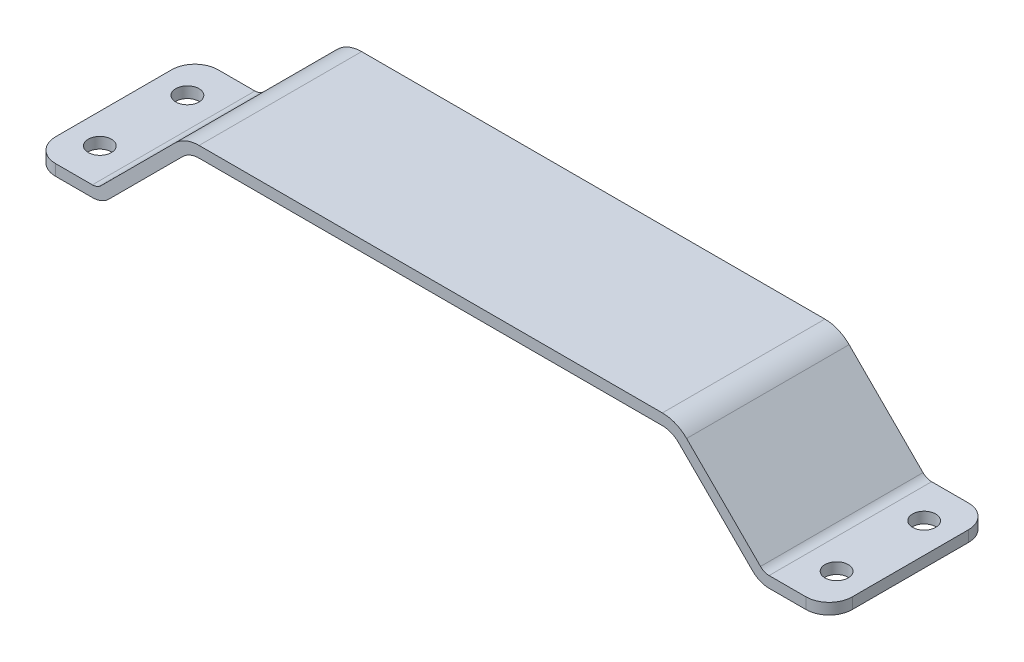
ISO-10303-21;
HEADER;
FILE_DESCRIPTION(('STEP AP214'),'2;1');
FILE_NAME('part.step','',(''),(''),'','','');
FILE_SCHEMA(('AUTOMOTIVE_DESIGN { 1 0 10303 214 1 1 1 1 }'));
ENDSEC;
DATA;
#1=APPLICATION_CONTEXT('core data for automotive mechanical design processes');
#2=APPLICATION_PROTOCOL_DEFINITION('international standard','automotive_design',2000,#1);
#3=PRODUCT_CONTEXT('',#1,'mechanical');
#4=PRODUCT('Part','Part','',(#3));
#5=PRODUCT_RELATED_PRODUCT_CATEGORY('part','',(#4));
#6=PRODUCT_DEFINITION_FORMATION('','',#4);
#7=PRODUCT_DEFINITION_CONTEXT('part definition',#1,'design');
#8=PRODUCT_DEFINITION('design','',#6,#7);
#9=PRODUCT_DEFINITION_SHAPE('','',#8);
#10=(LENGTH_UNIT() NAMED_UNIT(*) SI_UNIT(.MILLI.,.METRE.));
#11=(NAMED_UNIT(*) PLANE_ANGLE_UNIT() SI_UNIT($,.RADIAN.));
#12=(NAMED_UNIT(*) SI_UNIT($,.STERADIAN.) SOLID_ANGLE_UNIT());
#13=UNCERTAINTY_MEASURE_WITH_UNIT(LENGTH_MEASURE(1.E-05),#10,'distance_accuracy_value','');
#14=(GEOMETRIC_REPRESENTATION_CONTEXT(3) GLOBAL_UNCERTAINTY_ASSIGNED_CONTEXT((#13)) GLOBAL_UNIT_ASSIGNED_CONTEXT((#10,
#11,#12)) REPRESENTATION_CONTEXT('',''));
#15=CARTESIAN_POINT('',(0.,0.,0.));
#16=DIRECTION('',(0.,0.,1.));
#17=DIRECTION('',(1.,0.,0.));
#18=AXIS2_PLACEMENT_3D('',#15,#16,#17);
#19=CARTESIAN_POINT('',(0.,-22.7099255390595,-70.));
#20=DIRECTION('',(0.,1.,0.));
#21=DIRECTION('',(-1.,0.,0.));
#22=AXIS2_PLACEMENT_3D('',#19,#20,#21);
#23=PLANE('',#22);
#24=CARTESIAN_POINT('',(-158.654890312498,-22.7099255390595,-16.145226185487));
#25=DIRECTION('',(0.,1.,0.));
#26=DIRECTION('',(-1.,0.,0.));
#27=AXIS2_PLACEMENT_3D('',#24,#25,#26);
#28=CIRCLE('',#27,4.99999999999999);
#29=CARTESIAN_POINT('',(-163.654890312498,-22.7099255390595,-16.145226185487));
#30=VERTEX_POINT('',#29);
#31=EDGE_CURVE('E407',#30,#30,#28,.T.);
#32=ORIENTED_EDGE('',*,*,#31,.T.);
#33=EDGE_LOOP('',(#32));
#34=FACE_BOUND('',#33,.T.);
#35=DIRECTION('',(-1.,0.,0.));
#36=VECTOR('',#35,1.);
#37=CARTESIAN_POINT('',(0.,-22.7099255390595,0.));
#38=LINE('',#37,#36);
#39=CARTESIAN_POINT('',(-145.725958124363,-22.7099255390595,0.));
#40=VERTEX_POINT('',#39);
#41=CARTESIAN_POINT('',(-161.583822500632,-22.7099255390595,0.));
#42=VERTEX_POINT('',#41);
#43=EDGE_CURVE('E286',#40,#42,#38,.T.);
#44=ORIENTED_EDGE('',*,*,#43,.T.);
#45=CARTESIAN_POINT('',(-161.583822500632,-22.7099255390595,-10.));
#46=DIRECTION('',(0.,1.,0.));
#47=DIRECTION('',(-1.,0.,0.));
#48=AXIS2_PLACEMENT_3D('',#45,#46,#47);
#49=CIRCLE('',#48,10.);
#50=CARTESIAN_POINT('',(-171.583822500632,-22.7099255390595,-10.));
#51=VERTEX_POINT('',#50);
#52=EDGE_CURVE('E370',#42,#51,#49,.F.);
#53=ORIENTED_EDGE('',*,*,#52,.T.);
#54=DIRECTION('',(0.,0.,1.));
#55=VECTOR('',#54,1.);
#56=CARTESIAN_POINT('',(-171.583822500632,-22.7099255390595,-70.));
#57=LINE('',#56,#55);
#58=CARTESIAN_POINT('',(-171.583822500632,-22.7099255390595,-60.));
#59=VERTEX_POINT('',#58);
#60=EDGE_CURVE('E343',#59,#51,#57,.T.);
#61=ORIENTED_EDGE('',*,*,#60,.F.);
#62=CARTESIAN_POINT('',(-161.583822500632,-22.7099255390595,-60.));
#63=DIRECTION('',(0.,1.,0.));
#64=DIRECTION('',(-1.,0.,0.));
#65=AXIS2_PLACEMENT_3D('',#62,#63,#64);
#66=CIRCLE('',#65,10.);
#67=CARTESIAN_POINT('',(-161.583822500632,-22.7099255390595,-70.));
#68=VERTEX_POINT('',#67);
#69=EDGE_CURVE('E364',#59,#68,#66,.F.);
#70=ORIENTED_EDGE('',*,*,#69,.T.);
#71=DIRECTION('',(-1.,0.,0.));
#72=VECTOR('',#71,1.);
#73=CARTESIAN_POINT('',(0.,-22.7099255390595,-70.));
#74=LINE('',#73,#72);
#75=CARTESIAN_POINT('',(-145.725958124363,-22.7099255390595,-70.));
#76=VERTEX_POINT('',#75);
#77=EDGE_CURVE('E247',#76,#68,#74,.T.);
#78=ORIENTED_EDGE('',*,*,#77,.F.);
#79=DIRECTION('',(0.,0.,1.));
#80=VECTOR('',#79,1.);
#81=CARTESIAN_POINT('',(-145.725958124363,-22.7099255390595,-70.));
#82=LINE('',#81,#80);
#83=EDGE_CURVE('E345',#76,#40,#82,.T.);
#84=ORIENTED_EDGE('',*,*,#83,.T.);
#85=EDGE_LOOP('',(#44,#53,#61,#70,#78,#84));
#86=FACE_BOUND('',#85,.T.);
#87=CARTESIAN_POINT('',(-158.654890312498,-22.7099255390595,-53.854773814513));
#88=DIRECTION('',(0.,1.,0.));
#89=DIRECTION('',(-1.,0.,0.));
#90=AXIS2_PLACEMENT_3D('',#87,#88,#89);
#91=CIRCLE('',#90,4.99999999999999);
#92=CARTESIAN_POINT('',(-163.654890312498,-22.7099255390595,-53.854773814513));
#93=VERTEX_POINT('',#92);
#94=EDGE_CURVE('E401',#93,#93,#91,.F.);
#95=ORIENTED_EDGE('',*,*,#94,.F.);
#96=EDGE_LOOP('',(#95));
#97=FACE_BOUND('',#96,.T.);
#98=ADVANCED_FACE('F41',(#34,#86,#97),#23,.F.);
#99=CARTESIAN_POINT('',(0.,-17.9499255390595,-70.));
#100=DIRECTION('',(0.,1.,0.));
#101=DIRECTION('',(0.,0.,1.));
#102=AXIS2_PLACEMENT_3D('',#99,#100,#101);
#103=PLANE('',#102);
#104=DIRECTION('',(0.,0.,1.));
#105=VECTOR('',#104,1.);
#106=CARTESIAN_POINT('',(-171.583822500632,-17.9499255390595,-70.));
#107=LINE('',#106,#105);
#108=CARTESIAN_POINT('',(-171.583822500632,-17.9499255390595,-60.));
#109=VERTEX_POINT('',#108);
#110=CARTESIAN_POINT('',(-171.583822500632,-17.9499255390595,-10.));
#111=VERTEX_POINT('',#110);
#112=EDGE_CURVE('E346',#109,#111,#107,.T.);
#113=ORIENTED_EDGE('',*,*,#112,.T.);
#114=CARTESIAN_POINT('',(-161.583822500632,-17.9499255390595,-10.));
#115=DIRECTION('',(0.,1.,0.));
#116=DIRECTION('',(0.,0.,1.));
#117=AXIS2_PLACEMENT_3D('',#114,#115,#116);
#118=CIRCLE('',#117,10.);
#119=CARTESIAN_POINT('',(-161.583822500632,-17.9499255390595,0.));
#120=VERTEX_POINT('',#119);
#121=EDGE_CURVE('E376',#111,#120,#118,.T.);
#122=ORIENTED_EDGE('',*,*,#121,.T.);
#123=DIRECTION('',(-1.,0.,0.));
#124=VECTOR('',#123,1.);
#125=CARTESIAN_POINT('',(0.,-17.9499255390595,0.));
#126=LINE('',#125,#124);
#127=CARTESIAN_POINT('',(-145.725958124363,-17.9499255390595,0.));
#128=VERTEX_POINT('',#127);
#129=EDGE_CURVE('E287',#128,#120,#126,.T.);
#130=ORIENTED_EDGE('',*,*,#129,.F.);
#131=DIRECTION('',(0.,0.,1.));
#132=VECTOR('',#131,1.);
#133=CARTESIAN_POINT('',(-145.725958124363,-17.9499255390595,-70.));
#134=LINE('',#133,#132);
#135=CARTESIAN_POINT('',(-145.725958124363,-17.9499255390595,-70.));
#136=VERTEX_POINT('',#135);
#137=EDGE_CURVE('E351',#136,#128,#134,.T.);
#138=ORIENTED_EDGE('',*,*,#137,.F.);
#139=DIRECTION('',(-1.,0.,0.));
#140=VECTOR('',#139,1.);
#141=CARTESIAN_POINT('',(0.,-17.9499255390595,-70.));
#142=LINE('',#141,#140);
#143=CARTESIAN_POINT('',(-161.583822500632,-17.9499255390595,-70.));
#144=VERTEX_POINT('',#143);
#145=EDGE_CURVE('E244',#136,#144,#142,.T.);
#146=ORIENTED_EDGE('',*,*,#145,.T.);
#147=CARTESIAN_POINT('',(-161.583822500632,-17.9499255390595,-60.));
#148=DIRECTION('',(0.,1.,0.));
#149=DIRECTION('',(0.,0.,1.));
#150=AXIS2_PLACEMENT_3D('',#147,#148,#149);
#151=CIRCLE('',#150,10.);
#152=EDGE_CURVE('E372',#144,#109,#151,.T.);
#153=ORIENTED_EDGE('',*,*,#152,.T.);
#154=EDGE_LOOP('',(#113,#122,#130,#138,#146,#153));
#155=FACE_BOUND('',#154,.T.);
#156=CARTESIAN_POINT('',(-158.654890312498,-17.9499255390595,-16.145226185487));
#157=DIRECTION('',(0.,-1.,0.));
#158=DIRECTION('',(1.,0.,0.));
#159=AXIS2_PLACEMENT_3D('',#156,#157,#158);
#160=CIRCLE('',#159,4.99999999999999);
#161=CARTESIAN_POINT('',(-153.654890312498,-17.9499255390595,-16.145226185487));
#162=VERTEX_POINT('',#161);
#163=EDGE_CURVE('E412',#162,#162,#160,.F.);
#164=ORIENTED_EDGE('',*,*,#163,.F.);
#165=EDGE_LOOP('',(#164));
#166=FACE_BOUND('',#165,.T.);
#167=CARTESIAN_POINT('',(-158.654890312498,-17.9499255390595,-53.854773814513));
#168=DIRECTION('',(0.,-1.,0.));
#169=DIRECTION('',(1.,0.,0.));
#170=AXIS2_PLACEMENT_3D('',#167,#168,#169);
#171=CIRCLE('',#170,4.99999999999999);
#172=CARTESIAN_POINT('',(-153.654890312498,-17.9499255390595,-53.854773814513));
#173=VERTEX_POINT('',#172);
#174=EDGE_CURVE('E410',#173,#173,#171,.T.);
#175=ORIENTED_EDGE('',*,*,#174,.T.);
#176=EDGE_LOOP('',(#175));
#177=FACE_BOUND('',#176,.T.);
#178=ADVANCED_FACE('F417',(#155,#166,#177),#103,.T.);
#179=CARTESIAN_POINT('',(0.,-17.9499255390595,-70.));
#180=DIRECTION('',(0.,-1.,0.));
#181=DIRECTION('',(1.,0.,0.));
#182=AXIS2_PLACEMENT_3D('',#179,#180,#181);
#183=PLANE('',#182);
#184=DIRECTION('',(0.,0.,1.));
#185=VECTOR('',#184,1.);
#186=CARTESIAN_POINT('',(171.583822500632,-17.9499255390595,-70.));
#187=LINE('',#186,#185);
#188=CARTESIAN_POINT('',(171.583822500632,-17.9499255390595,-60.));
#189=VERTEX_POINT('',#188);
#190=CARTESIAN_POINT('',(171.583822500632,-17.9499255390595,-10.));
#191=VERTEX_POINT('',#190);
#192=EDGE_CURVE('E321',#189,#191,#187,.T.);
#193=ORIENTED_EDGE('',*,*,#192,.F.);
#194=CARTESIAN_POINT('',(161.583822500632,-17.9499255390595,-60.));
#195=DIRECTION('',(0.,-1.,0.));
#196=DIRECTION('',(1.,0.,0.));
#197=AXIS2_PLACEMENT_3D('',#194,#195,#196);
#198=CIRCLE('',#197,10.);
#199=CARTESIAN_POINT('',(161.583822500632,-17.9499255390595,-70.));
#200=VERTEX_POINT('',#199);
#201=EDGE_CURVE('E11',#189,#200,#198,.F.);
#202=ORIENTED_EDGE('',*,*,#201,.T.);
#203=DIRECTION('',(1.,0.,0.));
#204=VECTOR('',#203,1.);
#205=CARTESIAN_POINT('',(0.,-17.9499255390595,-70.));
#206=LINE('',#205,#204);
#207=CARTESIAN_POINT('',(145.725958124363,-17.9499255390595,-70.));
#208=VERTEX_POINT('',#207);
#209=EDGE_CURVE('E268',#208,#200,#206,.T.);
#210=ORIENTED_EDGE('',*,*,#209,.F.);
#211=DIRECTION('',(0.,0.,1.));
#212=VECTOR('',#211,1.);
#213=CARTESIAN_POINT('',(145.725958124363,-17.9499255390595,-70.));
#214=LINE('',#213,#212);
#215=CARTESIAN_POINT('',(145.725958124363,-17.9499255390595,0.));
#216=VERTEX_POINT('',#215);
#217=EDGE_CURVE('E318',#208,#216,#214,.T.);
#218=ORIENTED_EDGE('',*,*,#217,.T.);
#219=DIRECTION('',(1.,0.,0.));
#220=VECTOR('',#219,1.);
#221=CARTESIAN_POINT('',(0.,-17.9499255390595,0.));
#222=LINE('',#221,#220);
#223=CARTESIAN_POINT('',(161.583822500632,-17.9499255390595,0.));
#224=VERTEX_POINT('',#223);
#225=EDGE_CURVE('E311',#216,#224,#222,.T.);
#226=ORIENTED_EDGE('',*,*,#225,.T.);
#227=CARTESIAN_POINT('',(161.583822500632,-17.9499255390595,-10.));
#228=DIRECTION('',(0.,-1.,0.));
#229=DIRECTION('',(1.,0.,0.));
#230=AXIS2_PLACEMENT_3D('',#227,#228,#229);
#231=CIRCLE('',#230,10.);
#232=EDGE_CURVE('E49',#224,#191,#231,.F.);
#233=ORIENTED_EDGE('',*,*,#232,.T.);
#234=EDGE_LOOP('',(#193,#202,#210,#218,#226,#233));
#235=FACE_BOUND('',#234,.T.);
#236=CARTESIAN_POINT('',(158.654890312498,-17.9499255390595,-16.145226185487));
#237=DIRECTION('',(0.,1.,0.));
#238=DIRECTION('',(-1.,0.,0.));
#239=AXIS2_PLACEMENT_3D('',#236,#237,#238);
#240=CIRCLE('',#239,4.99999999999999);
#241=CARTESIAN_POINT('',(153.654890312498,-17.9499255390595,-16.145226185487));
#242=VERTEX_POINT('',#241);
#243=EDGE_CURVE('E399',#242,#242,#240,.F.);
#244=ORIENTED_EDGE('',*,*,#243,.T.);
#245=EDGE_LOOP('',(#244));
#246=FACE_BOUND('',#245,.T.);
#247=CARTESIAN_POINT('',(158.654890312498,-17.9499255390595,-53.854773814513));
#248=DIRECTION('',(0.,1.,0.));
#249=DIRECTION('',(-1.,0.,0.));
#250=AXIS2_PLACEMENT_3D('',#247,#248,#249);
#251=CIRCLE('',#250,4.99999999999999);
#252=CARTESIAN_POINT('',(153.654890312498,-17.9499255390595,-53.854773814513));
#253=VERTEX_POINT('',#252);
#254=EDGE_CURVE('E394',#253,#253,#251,.T.);
#255=ORIENTED_EDGE('',*,*,#254,.F.);
#256=EDGE_LOOP('',(#255));
#257=FACE_BOUND('',#256,.T.);
#258=ADVANCED_FACE('F433',(#235,#246,#257),#183,.F.);
#259=CARTESIAN_POINT('',(0.,-22.7099255390595,-70.));
#260=DIRECTION('',(0.,-1.,0.));
#261=DIRECTION('',(1.,0.,0.));
#262=AXIS2_PLACEMENT_3D('',#259,#260,#261);
#263=PLANE('',#262);
#264=CARTESIAN_POINT('',(158.654890312498,-22.7099255390595,-16.145226185487));
#265=DIRECTION('',(0.,-1.,0.));
#266=DIRECTION('',(1.,0.,0.));
#267=AXIS2_PLACEMENT_3D('',#264,#265,#266);
#268=CIRCLE('',#267,4.99999999999999);
#269=CARTESIAN_POINT('',(163.654890312498,-22.7099255390595,-16.145226185487));
#270=VERTEX_POINT('',#269);
#271=EDGE_CURVE('E391',#270,#270,#268,.F.);
#272=ORIENTED_EDGE('',*,*,#271,.T.);
#273=EDGE_LOOP('',(#272));
#274=FACE_BOUND('',#273,.T.);
#275=DIRECTION('',(1.,0.,0.));
#276=VECTOR('',#275,1.);
#277=CARTESIAN_POINT('',(0.,-22.7099255390595,-70.));
#278=LINE('',#277,#276);
#279=CARTESIAN_POINT('',(145.725958124363,-22.7099255390595,-70.));
#280=VERTEX_POINT('',#279);
#281=CARTESIAN_POINT('',(161.583822500632,-22.7099255390595,-70.));
#282=VERTEX_POINT('',#281);
#283=EDGE_CURVE('E264',#280,#282,#278,.T.);
#284=ORIENTED_EDGE('',*,*,#283,.T.);
#285=CARTESIAN_POINT('',(161.583822500632,-22.7099255390595,-60.));
#286=DIRECTION('',(0.,-1.,0.));
#287=DIRECTION('',(1.,0.,0.));
#288=AXIS2_PLACEMENT_3D('',#285,#286,#287);
#289=CIRCLE('',#288,10.);
#290=CARTESIAN_POINT('',(171.583822500632,-22.7099255390595,-60.));
#291=VERTEX_POINT('',#290);
#292=EDGE_CURVE('E384',#282,#291,#289,.T.);
#293=ORIENTED_EDGE('',*,*,#292,.T.);
#294=DIRECTION('',(0.,0.,1.));
#295=VECTOR('',#294,1.);
#296=CARTESIAN_POINT('',(171.583822500632,-22.7099255390595,-70.));
#297=LINE('',#296,#295);
#298=CARTESIAN_POINT('',(171.583822500632,-22.7099255390595,-10.));
#299=VERTEX_POINT('',#298);
#300=EDGE_CURVE('E323',#291,#299,#297,.T.);
#301=ORIENTED_EDGE('',*,*,#300,.T.);
#302=CARTESIAN_POINT('',(161.583822500632,-22.7099255390595,-10.));
#303=DIRECTION('',(0.,-1.,0.));
#304=DIRECTION('',(1.,0.,0.));
#305=AXIS2_PLACEMENT_3D('',#302,#303,#304);
#306=CIRCLE('',#305,10.);
#307=CARTESIAN_POINT('',(161.583822500632,-22.7099255390595,0.));
#308=VERTEX_POINT('',#307);
#309=EDGE_CURVE('E382',#299,#308,#306,.T.);
#310=ORIENTED_EDGE('',*,*,#309,.T.);
#311=DIRECTION('',(1.,0.,0.));
#312=VECTOR('',#311,1.);
#313=CARTESIAN_POINT('',(0.,-22.7099255390595,0.));
#314=LINE('',#313,#312);
#315=CARTESIAN_POINT('',(145.725958124363,-22.7099255390595,0.));
#316=VERTEX_POINT('',#315);
#317=EDGE_CURVE('E309',#316,#308,#314,.T.);
#318=ORIENTED_EDGE('',*,*,#317,.F.);
#319=DIRECTION('',(0.,0.,1.));
#320=VECTOR('',#319,1.);
#321=CARTESIAN_POINT('',(145.725958124363,-22.7099255390595,-70.));
#322=LINE('',#321,#320);
#323=EDGE_CURVE('E326',#280,#316,#322,.T.);
#324=ORIENTED_EDGE('',*,*,#323,.F.);
#325=EDGE_LOOP('',(#284,#293,#301,#310,#318,#324));
#326=FACE_BOUND('',#325,.T.);
#327=CARTESIAN_POINT('',(158.654890312498,-22.7099255390595,-53.854773814513));
#328=DIRECTION('',(0.,-1.,0.));
#329=DIRECTION('',(1.,0.,0.));
#330=AXIS2_PLACEMENT_3D('',#327,#328,#329);
#331=CIRCLE('',#330,4.99999999999999);
#332=CARTESIAN_POINT('',(163.654890312498,-22.7099255390595,-53.854773814513));
#333=VERTEX_POINT('',#332);
#334=EDGE_CURVE('E44',#333,#333,#331,.T.);
#335=ORIENTED_EDGE('',*,*,#334,.F.);
#336=EDGE_LOOP('',(#335));
#337=FACE_BOUND('',#336,.T.);
#338=ADVANCED_FACE('F467',(#274,#326,#337),#263,.T.);
#339=CARTESIAN_POINT('',(62.8027767592346,62.8027767592344,-70.));
#340=DIRECTION('',(-0.707106781186548,-0.707106781186547,0.));
#341=DIRECTION('',(0.707106781186547,-0.707106781186548,0.));
#342=AXIS2_PLACEMENT_3D('',#339,#340,#341);
#343=PLANE('',#342);
#344=DIRECTION('',(0.707106781186547,-0.707106781186548,0.));
#345=VECTOR('',#344,1.);
#346=CARTESIAN_POINT('',(62.8027767592346,62.8027767592344,0.));
#347=LINE('',#346,#345);
#348=CARTESIAN_POINT('',(110.200913437551,15.4046400809177,0.));
#349=VERTEX_POINT('',#348);
#350=CARTESIAN_POINT('',(142.020718590946,-16.4151650724769,0.));
#351=VERTEX_POINT('',#350);
#352=EDGE_CURVE('E275',#349,#351,#347,.T.);
#353=ORIENTED_EDGE('',*,*,#352,.T.);
#354=DIRECTION('',(0.,0.,1.));
#355=VECTOR('',#354,1.);
#356=CARTESIAN_POINT('',(142.020718590946,-16.4151650724769,-70.));
#357=LINE('',#356,#355);
#358=CARTESIAN_POINT('',(142.020718590946,-16.4151650724769,-70.));
#359=VERTEX_POINT('',#358);
#360=EDGE_CURVE('E225',#359,#351,#357,.T.);
#361=ORIENTED_EDGE('',*,*,#360,.F.);
#362=DIRECTION('',(0.707106781186547,-0.707106781186548,0.));
#363=VECTOR('',#362,1.);
#364=CARTESIAN_POINT('',(62.8027767592346,62.8027767592344,-70.));
#365=LINE('',#364,#363);
#366=CARTESIAN_POINT('',(110.200913437551,15.4046400809177,-70.));
#367=VERTEX_POINT('',#366);
#368=EDGE_CURVE('E218',#367,#359,#365,.T.);
#369=ORIENTED_EDGE('',*,*,#368,.F.);
#370=DIRECTION('',(0.,0.,1.));
#371=VECTOR('',#370,1.);
#372=CARTESIAN_POINT('',(110.200913437551,15.4046400809177,-70.));
#373=LINE('',#372,#371);
#374=EDGE_CURVE('E204',#367,#349,#373,.T.);
#375=ORIENTED_EDGE('',*,*,#374,.T.);
#376=EDGE_LOOP('',(#353,#361,#369,#375));
#377=FACE_BOUND('',#376,.T.);
#378=ADVANCED_FACE('F219',(#377),#343,.F.);
#379=CARTESIAN_POINT('',(145.725958124363,-12.7099255390595,-70.));
#380=DIRECTION('',(0.,0.,1.));
#381=DIRECTION('',(1.,0.,0.));
#382=AXIS2_PLACEMENT_3D('',#379,#380,#381);
#383=CYLINDRICAL_SURFACE('',#382,5.23999999999999);
#384=CARTESIAN_POINT('',(145.725958124363,-12.7099255390595,0.));
#385=DIRECTION('',(0.,0.,1.));
#386=DIRECTION('',(1.,0.,0.));
#387=AXIS2_PLACEMENT_3D('',#384,#385,#386);
#388=CIRCLE('',#387,5.23999999999999);
#389=EDGE_CURVE('E221',#351,#216,#388,.T.);
#390=ORIENTED_EDGE('',*,*,#389,.T.);
#391=ORIENTED_EDGE('',*,*,#217,.F.);
#392=CARTESIAN_POINT('',(145.725958124363,-12.7099255390595,-70.));
#393=DIRECTION('',(0.,0.,1.));
#394=DIRECTION('',(1.,0.,0.));
#395=AXIS2_PLACEMENT_3D('',#392,#393,#394);
#396=CIRCLE('',#395,5.23999999999999);
#397=EDGE_CURVE('E214',#359,#208,#396,.T.);
#398=ORIENTED_EDGE('',*,*,#397,.F.);
#399=ORIENTED_EDGE('',*,*,#360,.T.);
#400=EDGE_LOOP('',(#390,#391,#398,#399));
#401=FACE_BOUND('',#400,.T.);
#402=ADVANCED_FACE('F465',(#401),#383,.F.);
#403=CARTESIAN_POINT('',(171.583822500632,0.,-70.));
#404=DIRECTION('',(-1.,0.,0.));
#405=DIRECTION('',(0.,0.,1.));
#406=AXIS2_PLACEMENT_3D('',#403,#404,#405);
#407=PLANE('',#406);
#408=ORIENTED_EDGE('',*,*,#300,.F.);
#409=DIRECTION('',(0.,-1.,0.));
#410=VECTOR('',#409,1.);
#411=CARTESIAN_POINT('',(171.583822500632,0.,-60.));
#412=LINE('',#411,#410);
#413=EDGE_CURVE('E63',#291,#189,#412,.F.);
#414=ORIENTED_EDGE('',*,*,#413,.T.);
#415=ORIENTED_EDGE('',*,*,#192,.T.);
#416=DIRECTION('',(0.,-1.,0.));
#417=VECTOR('',#416,1.);
#418=CARTESIAN_POINT('',(171.583822500632,-22.7099255390595,-10.));
#419=LINE('',#418,#417);
#420=EDGE_CURVE('E390',#191,#299,#419,.T.);
#421=ORIENTED_EDGE('',*,*,#420,.T.);
#422=EDGE_LOOP('',(#408,#414,#415,#421));
#423=FACE_BOUND('',#422,.T.);
#424=ADVANCED_FACE('F494',(#423),#407,.F.);
#425=CARTESIAN_POINT('',(145.725958124363,-12.7099255390595,-70.));
#426=DIRECTION('',(0.,0.,1.));
#427=DIRECTION('',(1.,0.,0.));
#428=AXIS2_PLACEMENT_3D('',#425,#426,#427);
#429=CYLINDRICAL_SURFACE('',#428,9.99999999999999);
#430=CARTESIAN_POINT('',(145.725958124363,-12.7099255390595,0.));
#431=DIRECTION('',(0.,0.,1.));
#432=DIRECTION('',(1.,0.,0.));
#433=AXIS2_PLACEMENT_3D('',#430,#431,#432);
#434=CIRCLE('',#433,9.99999999999999);
#435=CARTESIAN_POINT('',(138.654890312498,-19.7809933509249,0.));
#436=VERTEX_POINT('',#435);
#437=EDGE_CURVE('E307',#436,#316,#434,.T.);
#438=ORIENTED_EDGE('',*,*,#437,.F.);
#439=DIRECTION('',(0.,0.,1.));
#440=VECTOR('',#439,1.);
#441=CARTESIAN_POINT('',(138.654890312498,-19.7809933509249,-70.));
#442=LINE('',#441,#440);
#443=CARTESIAN_POINT('',(138.654890312498,-19.7809933509249,-70.));
#444=VERTEX_POINT('',#443);
#445=EDGE_CURVE('E327',#444,#436,#442,.T.);
#446=ORIENTED_EDGE('',*,*,#445,.F.);
#447=CARTESIAN_POINT('',(145.725958124363,-12.7099255390595,-70.));
#448=DIRECTION('',(0.,0.,1.));
#449=DIRECTION('',(1.,0.,0.));
#450=AXIS2_PLACEMENT_3D('',#447,#448,#449);
#451=CIRCLE('',#450,9.99999999999999);
#452=EDGE_CURVE('E265',#444,#280,#451,.T.);
#453=ORIENTED_EDGE('',*,*,#452,.T.);
#454=ORIENTED_EDGE('',*,*,#323,.T.);
#455=EDGE_LOOP('',(#438,#446,#453,#454));
#456=FACE_BOUND('',#455,.T.);
#457=ADVANCED_FACE('F502',(#456),#429,.T.);
#458=CARTESIAN_POINT('',(59.4369484807867,59.4369484807865,-70.));
#459=DIRECTION('',(-0.707106781186549,-0.707106781186546,0.));
#460=DIRECTION('',(0.707106781186546,-0.707106781186549,0.));
#461=AXIS2_PLACEMENT_3D('',#458,#459,#460);
#462=PLANE('',#461);
#463=DIRECTION('',(0.707106781186546,-0.707106781186549,0.));
#464=VECTOR('',#463,1.);
#465=CARTESIAN_POINT('',(59.4369484807867,59.4369484807865,0.));
#466=LINE('',#465,#464);
#467=CARTESIAN_POINT('',(106.835085159103,12.0388118024698,0.));
#468=VERTEX_POINT('',#467);
#469=EDGE_CURVE('E301',#468,#436,#466,.T.);
#470=ORIENTED_EDGE('',*,*,#469,.F.);
#471=DIRECTION('',(0.,0.,1.));
#472=VECTOR('',#471,1.);
#473=CARTESIAN_POINT('',(106.835085159103,12.0388118024698,-70.));
#474=LINE('',#473,#472);
#475=CARTESIAN_POINT('',(106.835085159103,12.0388118024698,-70.));
#476=VERTEX_POINT('',#475);
#477=EDGE_CURVE('E329',#476,#468,#474,.T.);
#478=ORIENTED_EDGE('',*,*,#477,.F.);
#479=DIRECTION('',(0.707106781186546,-0.707106781186549,0.));
#480=VECTOR('',#479,1.);
#481=CARTESIAN_POINT('',(59.4369484807867,59.4369484807865,-70.));
#482=LINE('',#481,#480);
#483=EDGE_CURVE('E259',#476,#444,#482,.T.);
#484=ORIENTED_EDGE('',*,*,#483,.T.);
#485=ORIENTED_EDGE('',*,*,#445,.T.);
#486=EDGE_LOOP('',(#470,#478,#484,#485));
#487=FACE_BOUND('',#486,.T.);
#488=ADVANCED_FACE('F505',(#487),#462,.T.);
#489=CARTESIAN_POINT('',(99.7640173472377,4.9677439906043,-70.));
#490=DIRECTION('',(0.,0.,1.));
#491=DIRECTION('',(1.,0.,0.));
#492=AXIS2_PLACEMENT_3D('',#489,#490,#491);
#493=CYLINDRICAL_SURFACE('',#492,10.);
#494=CARTESIAN_POINT('',(99.7640173472377,4.9677439906043,0.));
#495=DIRECTION('',(0.,0.,1.));
#496=DIRECTION('',(1.,0.,0.));
#497=AXIS2_PLACEMENT_3D('',#494,#495,#496);
#498=CIRCLE('',#497,10.);
#499=CARTESIAN_POINT('',(99.7640173472377,14.9677439906043,0.));
#500=VERTEX_POINT('',#499);
#501=EDGE_CURVE('E305',#468,#500,#498,.T.);
#502=ORIENTED_EDGE('',*,*,#501,.T.);
#503=DIRECTION('',(0.,0.,1.));
#504=VECTOR('',#503,1.);
#505=CARTESIAN_POINT('',(99.7640173472377,14.9677439906043,-70.));
#506=LINE('',#505,#504);
#507=CARTESIAN_POINT('',(99.7640173472377,14.9677439906043,-70.));
#508=VERTEX_POINT('',#507);
#509=EDGE_CURVE('E335',#508,#500,#506,.T.);
#510=ORIENTED_EDGE('',*,*,#509,.F.);
#511=CARTESIAN_POINT('',(99.7640173472377,4.9677439906043,-70.));
#512=DIRECTION('',(0.,0.,1.));
#513=DIRECTION('',(1.,0.,0.));
#514=AXIS2_PLACEMENT_3D('',#511,#512,#513);
#515=CIRCLE('',#514,10.);
#516=EDGE_CURVE('E260',#476,#508,#515,.T.);
#517=ORIENTED_EDGE('',*,*,#516,.F.);
#518=ORIENTED_EDGE('',*,*,#477,.T.);
#519=EDGE_LOOP('',(#502,#510,#517,#518));
#520=FACE_BOUND('',#519,.T.);
#521=ADVANCED_FACE('F515',(#520),#493,.F.);
#522=CARTESIAN_POINT('',(0.,14.9677439906043,-70.));
#523=DIRECTION('',(0.,1.,0.));
#524=DIRECTION('',(-1.,0.,0.));
#525=AXIS2_PLACEMENT_3D('',#522,#523,#524);
#526=PLANE('',#525);
#527=DIRECTION('',(-1.,0.,0.));
#528=VECTOR('',#527,1.);
#529=CARTESIAN_POINT('',(0.,14.9677439906043,0.));
#530=LINE('',#529,#528);
#531=CARTESIAN_POINT('',(-99.7640173472377,14.9677439906043,0.));
#532=VERTEX_POINT('',#531);
#533=EDGE_CURVE('E298',#500,#532,#530,.T.);
#534=ORIENTED_EDGE('',*,*,#533,.T.);
#535=DIRECTION('',(0.,0.,1.));
#536=VECTOR('',#535,1.);
#537=CARTESIAN_POINT('',(-99.7640173472377,14.9677439906043,-70.));
#538=LINE('',#537,#536);
#539=CARTESIAN_POINT('',(-99.7640173472377,14.9677439906043,-70.));
#540=VERTEX_POINT('',#539);
#541=EDGE_CURVE('E333',#540,#532,#538,.T.);
#542=ORIENTED_EDGE('',*,*,#541,.F.);
#543=DIRECTION('',(-1.,0.,0.));
#544=VECTOR('',#543,1.);
#545=CARTESIAN_POINT('',(0.,14.9677439906043,-70.));
#546=LINE('',#545,#544);
#547=EDGE_CURVE('E254',#508,#540,#546,.T.);
#548=ORIENTED_EDGE('',*,*,#547,.F.);
#549=ORIENTED_EDGE('',*,*,#509,.T.);
#550=EDGE_LOOP('',(#534,#542,#548,#549));
#551=FACE_BOUND('',#550,.T.);
#552=ADVANCED_FACE('F516',(#551),#526,.F.);
#553=CARTESIAN_POINT('',(-99.7640173472377,4.96774399060428,-70.));
#554=DIRECTION('',(0.,0.,1.));
#555=DIRECTION('',(1.,0.,0.));
#556=AXIS2_PLACEMENT_3D('',#553,#554,#555);
#557=CYLINDRICAL_SURFACE('',#556,10.);
#558=CARTESIAN_POINT('',(-99.7640173472377,4.96774399060428,0.));
#559=DIRECTION('',(0.,0.,1.));
#560=DIRECTION('',(1.,0.,0.));
#561=AXIS2_PLACEMENT_3D('',#558,#559,#560);
#562=CIRCLE('',#561,10.);
#563=CARTESIAN_POINT('',(-106.835085159103,12.0388118024697,0.));
#564=VERTEX_POINT('',#563);
#565=EDGE_CURVE('E296',#564,#532,#562,.F.);
#566=ORIENTED_EDGE('',*,*,#565,.F.);
#567=DIRECTION('',(0.,0.,1.));
#568=VECTOR('',#567,1.);
#569=CARTESIAN_POINT('',(-106.835085159103,12.0388118024697,-70.));
#570=LINE('',#569,#568);
#571=CARTESIAN_POINT('',(-106.835085159103,12.0388118024697,-70.));
#572=VERTEX_POINT('',#571);
#573=EDGE_CURVE('E337',#572,#564,#570,.T.);
#574=ORIENTED_EDGE('',*,*,#573,.F.);
#575=CARTESIAN_POINT('',(-99.7640173472377,4.96774399060428,-70.));
#576=DIRECTION('',(0.,0.,1.));
#577=DIRECTION('',(1.,0.,0.));
#578=AXIS2_PLACEMENT_3D('',#575,#576,#577);
#579=CIRCLE('',#578,10.);
#580=EDGE_CURVE('E252',#572,#540,#579,.F.);
#581=ORIENTED_EDGE('',*,*,#580,.T.);
#582=ORIENTED_EDGE('',*,*,#541,.T.);
#583=EDGE_LOOP('',(#566,#574,#581,#582));
#584=FACE_BOUND('',#583,.T.);
#585=ADVANCED_FACE('F518',(#584),#557,.F.);
#586=CARTESIAN_POINT('',(-59.4369484807867,59.4369484807865,-70.));
#587=DIRECTION('',(-0.707106781186549,0.707106781186546,0.));
#588=DIRECTION('',(-0.707106781186546,-0.707106781186549,0.));
#589=AXIS2_PLACEMENT_3D('',#586,#587,#588);
#590=PLANE('',#589);
#591=DIRECTION('',(-0.707106781186546,-0.707106781186549,0.));
#592=VECTOR('',#591,1.);
#593=CARTESIAN_POINT('',(-59.4369484807867,59.4369484807865,0.));
#594=LINE('',#593,#592);
#595=CARTESIAN_POINT('',(-138.654890312498,-19.7809933509249,0.));
#596=VERTEX_POINT('',#595);
#597=EDGE_CURVE('E294',#564,#596,#594,.T.);
#598=ORIENTED_EDGE('',*,*,#597,.T.);
#599=DIRECTION('',(0.,0.,1.));
#600=VECTOR('',#599,1.);
#601=CARTESIAN_POINT('',(-138.654890312498,-19.7809933509249,-70.));
#602=LINE('',#601,#600);
#603=CARTESIAN_POINT('',(-138.654890312498,-19.7809933509249,-70.));
#604=VERTEX_POINT('',#603);
#605=EDGE_CURVE('E338',#604,#596,#602,.T.);
#606=ORIENTED_EDGE('',*,*,#605,.F.);
#607=DIRECTION('',(-0.707106781186546,-0.707106781186549,0.));
#608=VECTOR('',#607,1.);
#609=CARTESIAN_POINT('',(-59.4369484807867,59.4369484807865,-70.));
#610=LINE('',#609,#608);
#611=EDGE_CURVE('E248',#572,#604,#610,.T.);
#612=ORIENTED_EDGE('',*,*,#611,.F.);
#613=ORIENTED_EDGE('',*,*,#573,.T.);
#614=EDGE_LOOP('',(#598,#606,#612,#613));
#615=FACE_BOUND('',#614,.T.);
#616=ADVANCED_FACE('F523',(#615),#590,.F.);
#617=CARTESIAN_POINT('',(-145.725958124363,-12.7099255390595,-70.));
#618=DIRECTION('',(0.,0.,1.));
#619=DIRECTION('',(1.,0.,0.));
#620=AXIS2_PLACEMENT_3D('',#617,#618,#619);
#621=CYLINDRICAL_SURFACE('',#620,9.99999999999999);
#622=CARTESIAN_POINT('',(-145.725958124363,-12.7099255390595,0.));
#623=DIRECTION('',(0.,0.,1.));
#624=DIRECTION('',(1.,0.,0.));
#625=AXIS2_PLACEMENT_3D('',#622,#623,#624);
#626=CIRCLE('',#625,9.99999999999999);
#627=EDGE_CURVE('E295',#596,#40,#626,.F.);
#628=ORIENTED_EDGE('',*,*,#627,.T.);
#629=ORIENTED_EDGE('',*,*,#83,.F.);
#630=CARTESIAN_POINT('',(-145.725958124363,-12.7099255390595,-70.));
#631=DIRECTION('',(0.,0.,1.));
#632=DIRECTION('',(1.,0.,0.));
#633=AXIS2_PLACEMENT_3D('',#630,#631,#632);
#634=CIRCLE('',#633,9.99999999999999);
#635=EDGE_CURVE('E249',#604,#76,#634,.F.);
#636=ORIENTED_EDGE('',*,*,#635,.F.);
#637=ORIENTED_EDGE('',*,*,#605,.T.);
#638=EDGE_LOOP('',(#628,#629,#636,#637));
#639=FACE_BOUND('',#638,.T.);
#640=ADVANCED_FACE('F438',(#639),#621,.T.);
#641=CARTESIAN_POINT('',(-171.583822500632,0.,-70.));
#642=DIRECTION('',(-1.,0.,0.));
#643=DIRECTION('',(0.,0.,1.));
#644=AXIS2_PLACEMENT_3D('',#641,#642,#643);
#645=PLANE('',#644);
#646=ORIENTED_EDGE('',*,*,#60,.T.);
#647=DIRECTION('',(0.,-1.,0.));
#648=VECTOR('',#647,1.);
#649=CARTESIAN_POINT('',(-171.583822500632,0.,-10.));
#650=LINE('',#649,#648);
#651=EDGE_CURVE('E375',#51,#111,#650,.F.);
#652=ORIENTED_EDGE('',*,*,#651,.T.);
#653=ORIENTED_EDGE('',*,*,#112,.F.);
#654=DIRECTION('',(0.,-1.,0.));
#655=VECTOR('',#654,1.);
#656=CARTESIAN_POINT('',(-171.583822500632,-22.7099255390595,-60.));
#657=LINE('',#656,#655);
#658=EDGE_CURVE('E369',#109,#59,#657,.T.);
#659=ORIENTED_EDGE('',*,*,#658,.T.);
#660=EDGE_LOOP('',(#646,#652,#653,#659));
#661=FACE_BOUND('',#660,.T.);
#662=ADVANCED_FACE('F442',(#661),#645,.T.);
#663=CARTESIAN_POINT('',(-145.725958124363,-12.7099255390595,-70.));
#664=DIRECTION('',(0.,0.,1.));
#665=DIRECTION('',(1.,0.,0.));
#666=AXIS2_PLACEMENT_3D('',#663,#664,#665);
#667=CYLINDRICAL_SURFACE('',#666,5.24);
#668=CARTESIAN_POINT('',(-145.725958124363,-12.7099255390595,0.));
#669=DIRECTION('',(0.,0.,1.));
#670=DIRECTION('',(1.,0.,0.));
#671=AXIS2_PLACEMENT_3D('',#668,#669,#670);
#672=CIRCLE('',#671,5.24);
#673=CARTESIAN_POINT('',(-142.020718590946,-16.415165072477,0.));
#674=VERTEX_POINT('',#673);
#675=EDGE_CURVE('E284',#674,#128,#672,.F.);
#676=ORIENTED_EDGE('',*,*,#675,.F.);
#677=DIRECTION('',(0.,0.,1.));
#678=VECTOR('',#677,1.);
#679=CARTESIAN_POINT('',(-142.020718590946,-16.415165072477,-70.));
#680=LINE('',#679,#678);
#681=CARTESIAN_POINT('',(-142.020718590946,-16.415165072477,-70.));
#682=VERTEX_POINT('',#681);
#683=EDGE_CURVE('E354',#682,#674,#680,.T.);
#684=ORIENTED_EDGE('',*,*,#683,.F.);
#685=CARTESIAN_POINT('',(-145.725958124363,-12.7099255390595,-70.));
#686=DIRECTION('',(0.,0.,1.));
#687=DIRECTION('',(1.,0.,0.));
#688=AXIS2_PLACEMENT_3D('',#685,#686,#687);
#689=CIRCLE('',#688,5.24);
#690=EDGE_CURVE('E238',#682,#136,#689,.F.);
#691=ORIENTED_EDGE('',*,*,#690,.T.);
#692=ORIENTED_EDGE('',*,*,#137,.T.);
#693=EDGE_LOOP('',(#676,#684,#691,#692));
#694=FACE_BOUND('',#693,.T.);
#695=ADVANCED_FACE('F444',(#694),#667,.F.);
#696=CARTESIAN_POINT('',(-62.8027767592347,62.8027767592344,-70.));
#697=DIRECTION('',(-0.707106781186549,0.707106781186546,0.));
#698=DIRECTION('',(-0.707106781186546,-0.707106781186549,0.));
#699=AXIS2_PLACEMENT_3D('',#696,#697,#698);
#700=PLANE('',#699);
#701=DIRECTION('',(-0.707106781186546,-0.707106781186549,0.));
#702=VECTOR('',#701,1.);
#703=CARTESIAN_POINT('',(-62.8027767592347,62.8027767592344,0.));
#704=LINE('',#703,#702);
#705=CARTESIAN_POINT('',(-110.200913437551,15.4046400809177,0.));
#706=VERTEX_POINT('',#705);
#707=EDGE_CURVE('E278',#706,#674,#704,.T.);
#708=ORIENTED_EDGE('',*,*,#707,.F.);
#709=DIRECTION('',(0.,0.,1.));
#710=VECTOR('',#709,1.);
#711=CARTESIAN_POINT('',(-110.200913437551,15.4046400809177,-70.));
#712=LINE('',#711,#710);
#713=CARTESIAN_POINT('',(-110.200913437551,15.4046400809177,-70.));
#714=VERTEX_POINT('',#713);
#715=EDGE_CURVE('E355',#714,#706,#712,.T.);
#716=ORIENTED_EDGE('',*,*,#715,.F.);
#717=DIRECTION('',(-0.707106781186546,-0.707106781186549,0.));
#718=VECTOR('',#717,1.);
#719=CARTESIAN_POINT('',(-62.8027767592347,62.8027767592344,-70.));
#720=LINE('',#719,#718);
#721=EDGE_CURVE('E240',#714,#682,#720,.T.);
#722=ORIENTED_EDGE('',*,*,#721,.T.);
#723=ORIENTED_EDGE('',*,*,#683,.T.);
#724=EDGE_LOOP('',(#708,#716,#722,#723));
#725=FACE_BOUND('',#724,.T.);
#726=ADVANCED_FACE('F449',(#725),#700,.T.);
#727=CARTESIAN_POINT('',(-99.7640173472377,4.96774399060428,-70.));
#728=DIRECTION('',(0.,0.,1.));
#729=DIRECTION('',(1.,0.,0.));
#730=AXIS2_PLACEMENT_3D('',#727,#728,#729);
#731=CYLINDRICAL_SURFACE('',#730,14.76);
#732=CARTESIAN_POINT('',(-99.7640173472377,4.96774399060428,0.));
#733=DIRECTION('',(0.,0.,1.));
#734=DIRECTION('',(1.,0.,0.));
#735=AXIS2_PLACEMENT_3D('',#732,#733,#734);
#736=CIRCLE('',#735,14.76);
#737=CARTESIAN_POINT('',(-99.7640173472377,19.7277439906043,0.));
#738=VERTEX_POINT('',#737);
#739=EDGE_CURVE('E279',#706,#738,#736,.F.);
#740=ORIENTED_EDGE('',*,*,#739,.T.);
#741=DIRECTION('',(0.,0.,1.));
#742=VECTOR('',#741,1.);
#743=CARTESIAN_POINT('',(-99.7640173472377,19.7277439906043,-70.));
#744=LINE('',#743,#742);
#745=CARTESIAN_POINT('',(-99.7640173472377,19.7277439906043,-70.));
#746=VERTEX_POINT('',#745);
#747=EDGE_CURVE('E360',#746,#738,#744,.T.);
#748=ORIENTED_EDGE('',*,*,#747,.F.);
#749=CARTESIAN_POINT('',(-99.7640173472377,4.96774399060428,-70.));
#750=DIRECTION('',(0.,0.,1.));
#751=DIRECTION('',(1.,0.,0.));
#752=AXIS2_PLACEMENT_3D('',#749,#750,#751);
#753=CIRCLE('',#752,14.76);
#754=EDGE_CURVE('E235',#714,#746,#753,.F.);
#755=ORIENTED_EDGE('',*,*,#754,.F.);
#756=ORIENTED_EDGE('',*,*,#715,.T.);
#757=EDGE_LOOP('',(#740,#748,#755,#756));
#758=FACE_BOUND('',#757,.T.);
#759=ADVANCED_FACE('F455',(#758),#731,.T.);
#760=CARTESIAN_POINT('',(0.,19.7277439906043,-70.));
#761=DIRECTION('',(0.,-1.,0.));
#762=DIRECTION('',(1.,0.,0.));
#763=AXIS2_PLACEMENT_3D('',#760,#761,#762);
#764=PLANE('',#763);
#765=DIRECTION('',(1.,0.,0.));
#766=VECTOR('',#765,1.);
#767=CARTESIAN_POINT('',(0.,19.7277439906043,0.));
#768=LINE('',#767,#766);
#769=CARTESIAN_POINT('',(99.7640173472377,19.7277439906043,0.));
#770=VERTEX_POINT('',#769);
#771=EDGE_CURVE('E274',#738,#770,#768,.T.);
#772=ORIENTED_EDGE('',*,*,#771,.T.);
#773=DIRECTION('',(0.,0.,1.));
#774=VECTOR('',#773,1.);
#775=CARTESIAN_POINT('',(99.7640173472377,19.7277439906043,-70.));
#776=LINE('',#775,#774);
#777=CARTESIAN_POINT('',(99.7640173472377,19.7277439906043,-70.));
#778=VERTEX_POINT('',#777);
#779=EDGE_CURVE('E212',#778,#770,#776,.T.);
#780=ORIENTED_EDGE('',*,*,#779,.F.);
#781=DIRECTION('',(1.,0.,0.));
#782=VECTOR('',#781,1.);
#783=CARTESIAN_POINT('',(0.,19.7277439906043,-70.));
#784=LINE('',#783,#782);
#785=EDGE_CURVE('E228',#746,#778,#784,.T.);
#786=ORIENTED_EDGE('',*,*,#785,.F.);
#787=ORIENTED_EDGE('',*,*,#747,.T.);
#788=EDGE_LOOP('',(#772,#780,#786,#787));
#789=FACE_BOUND('',#788,.T.);
#790=ADVANCED_FACE('F457',(#789),#764,.F.);
#791=CARTESIAN_POINT('',(99.7640173472377,4.9677439906043,-70.));
#792=DIRECTION('',(0.,0.,1.));
#793=DIRECTION('',(1.,0.,0.));
#794=AXIS2_PLACEMENT_3D('',#791,#792,#793);
#795=CYLINDRICAL_SURFACE('',#794,14.76);
#796=CARTESIAN_POINT('',(99.7640173472377,4.9677439906043,0.));
#797=DIRECTION('',(0.,0.,1.));
#798=DIRECTION('',(1.,0.,0.));
#799=AXIS2_PLACEMENT_3D('',#796,#797,#798);
#800=CIRCLE('',#799,14.76);
#801=EDGE_CURVE('E209',#349,#770,#800,.T.);
#802=ORIENTED_EDGE('',*,*,#801,.F.);
#803=ORIENTED_EDGE('',*,*,#374,.F.);
#804=CARTESIAN_POINT('',(99.7640173472377,4.9677439906043,-70.));
#805=DIRECTION('',(0.,0.,1.));
#806=DIRECTION('',(1.,0.,0.));
#807=AXIS2_PLACEMENT_3D('',#804,#805,#806);
#808=CIRCLE('',#807,14.76);
#809=EDGE_CURVE('E208',#367,#778,#808,.T.);
#810=ORIENTED_EDGE('',*,*,#809,.T.);
#811=ORIENTED_EDGE('',*,*,#779,.T.);
#812=EDGE_LOOP('',(#802,#803,#810,#811));
#813=FACE_BOUND('',#812,.T.);
#814=ADVANCED_FACE('F206',(#813),#795,.T.);
#815=CARTESIAN_POINT('',(0.,0.,-70.));
#816=DIRECTION('',(0.,0.,1.));
#817=DIRECTION('',(1.,0.,0.));
#818=AXIS2_PLACEMENT_3D('',#815,#816,#817);
#819=PLANE('',#818);
#820=ORIENTED_EDGE('',*,*,#77,.T.);
#821=DIRECTION('',(0.,-1.,0.));
#822=VECTOR('',#821,1.);
#823=CARTESIAN_POINT('',(-161.583822500632,-17.9499255390595,-70.));
#824=LINE('',#823,#822);
#825=EDGE_CURVE('E381',#68,#144,#824,.F.);
#826=ORIENTED_EDGE('',*,*,#825,.T.);
#827=ORIENTED_EDGE('',*,*,#145,.F.);
#828=ORIENTED_EDGE('',*,*,#690,.F.);
#829=ORIENTED_EDGE('',*,*,#721,.F.);
#830=ORIENTED_EDGE('',*,*,#754,.T.);
#831=ORIENTED_EDGE('',*,*,#785,.T.);
#832=ORIENTED_EDGE('',*,*,#809,.F.);
#833=ORIENTED_EDGE('',*,*,#368,.T.);
#834=ORIENTED_EDGE('',*,*,#397,.T.);
#835=ORIENTED_EDGE('',*,*,#209,.T.);
#836=DIRECTION('',(0.,-1.,0.));
#837=VECTOR('',#836,1.);
#838=CARTESIAN_POINT('',(161.583822500632,0.,-70.));
#839=LINE('',#838,#837);
#840=EDGE_CURVE('E378',#200,#282,#839,.T.);
#841=ORIENTED_EDGE('',*,*,#840,.T.);
#842=ORIENTED_EDGE('',*,*,#283,.F.);
#843=ORIENTED_EDGE('',*,*,#452,.F.);
#844=ORIENTED_EDGE('',*,*,#483,.F.);
#845=ORIENTED_EDGE('',*,*,#516,.T.);
#846=ORIENTED_EDGE('',*,*,#547,.T.);
#847=ORIENTED_EDGE('',*,*,#580,.F.);
#848=ORIENTED_EDGE('',*,*,#611,.T.);
#849=ORIENTED_EDGE('',*,*,#635,.T.);
#850=EDGE_LOOP('',(#820,#826,#827,#828,#829,#830,#831,#832,#833,#834,#835,#841,#842,#843,#844,
#845,#846,#847,#848,#849));
#851=FACE_BOUND('',#850,.T.);
#852=ADVANCED_FACE('F227',(#851),#819,.F.);
#853=CARTESIAN_POINT('',(0.,0.,0.));
#854=DIRECTION('',(0.,0.,1.));
#855=DIRECTION('',(1.,0.,0.));
#856=AXIS2_PLACEMENT_3D('',#853,#854,#855);
#857=PLANE('',#856);
#858=ORIENTED_EDGE('',*,*,#129,.T.);
#859=DIRECTION('',(0.,-1.,0.));
#860=VECTOR('',#859,1.);
#861=CARTESIAN_POINT('',(-161.583822500632,0.,0.));
#862=LINE('',#861,#860);
#863=EDGE_CURVE('E362',#120,#42,#862,.T.);
#864=ORIENTED_EDGE('',*,*,#863,.T.);
#865=ORIENTED_EDGE('',*,*,#43,.F.);
#866=ORIENTED_EDGE('',*,*,#627,.F.);
#867=ORIENTED_EDGE('',*,*,#597,.F.);
#868=ORIENTED_EDGE('',*,*,#565,.T.);
#869=ORIENTED_EDGE('',*,*,#533,.F.);
#870=ORIENTED_EDGE('',*,*,#501,.F.);
#871=ORIENTED_EDGE('',*,*,#469,.T.);
#872=ORIENTED_EDGE('',*,*,#437,.T.);
#873=ORIENTED_EDGE('',*,*,#317,.T.);
#874=DIRECTION('',(0.,-1.,0.));
#875=VECTOR('',#874,1.);
#876=CARTESIAN_POINT('',(161.583822500632,-17.9499255390595,0.));
#877=LINE('',#876,#875);
#878=EDGE_CURVE('E320',#308,#224,#877,.F.);
#879=ORIENTED_EDGE('',*,*,#878,.T.);
#880=ORIENTED_EDGE('',*,*,#225,.F.);
#881=ORIENTED_EDGE('',*,*,#389,.F.);
#882=ORIENTED_EDGE('',*,*,#352,.F.);
#883=ORIENTED_EDGE('',*,*,#801,.T.);
#884=ORIENTED_EDGE('',*,*,#771,.F.);
#885=ORIENTED_EDGE('',*,*,#739,.F.);
#886=ORIENTED_EDGE('',*,*,#707,.T.);
#887=ORIENTED_EDGE('',*,*,#675,.T.);
#888=EDGE_LOOP('',(#858,#864,#865,#866,#867,#868,#869,#870,#871,#872,#873,#879,#880,#881,#882,
#883,#884,#885,#886,#887));
#889=FACE_BOUND('',#888,.T.);
#890=ADVANCED_FACE('F473',(#889),#857,.T.);
#891=CARTESIAN_POINT('',(-161.583822500632,0.,-10.));
#892=DIRECTION('',(0.,-1.,0.));
#893=DIRECTION('',(0.,0.,-1.));
#894=AXIS2_PLACEMENT_3D('',#891,#892,#893);
#895=CYLINDRICAL_SURFACE('',#894,10.);
#896=ORIENTED_EDGE('',*,*,#121,.F.);
#897=ORIENTED_EDGE('',*,*,#651,.F.);
#898=ORIENTED_EDGE('',*,*,#52,.F.);
#899=ORIENTED_EDGE('',*,*,#863,.F.);
#900=EDGE_LOOP('',(#896,#897,#898,#899));
#901=FACE_BOUND('',#900,.T.);
#902=ADVANCED_FACE('F470',(#901),#895,.T.);
#903=CARTESIAN_POINT('',(-161.583822500632,0.,-60.));
#904=DIRECTION('',(0.,1.,0.));
#905=DIRECTION('',(0.,0.,1.));
#906=AXIS2_PLACEMENT_3D('',#903,#904,#905);
#907=CYLINDRICAL_SURFACE('',#906,10.);
#908=ORIENTED_EDGE('',*,*,#152,.F.);
#909=ORIENTED_EDGE('',*,*,#825,.F.);
#910=ORIENTED_EDGE('',*,*,#69,.F.);
#911=ORIENTED_EDGE('',*,*,#658,.F.);
#912=EDGE_LOOP('',(#908,#909,#910,#911));
#913=FACE_BOUND('',#912,.T.);
#914=ADVANCED_FACE('F468',(#913),#907,.T.);
#915=CARTESIAN_POINT('',(161.583822500632,0.,-60.));
#916=DIRECTION('',(0.,-1.,0.));
#917=DIRECTION('',(0.,0.,-1.));
#918=AXIS2_PLACEMENT_3D('',#915,#916,#917);
#919=CYLINDRICAL_SURFACE('',#918,10.);
#920=ORIENTED_EDGE('',*,*,#201,.F.);
#921=ORIENTED_EDGE('',*,*,#413,.F.);
#922=ORIENTED_EDGE('',*,*,#292,.F.);
#923=ORIENTED_EDGE('',*,*,#840,.F.);
#924=EDGE_LOOP('',(#920,#921,#922,#923));
#925=FACE_BOUND('',#924,.T.);
#926=ADVANCED_FACE('F475',(#925),#919,.T.);
#927=CARTESIAN_POINT('',(161.583822500632,0.,-10.));
#928=DIRECTION('',(0.,1.,0.));
#929=DIRECTION('',(0.,0.,1.));
#930=AXIS2_PLACEMENT_3D('',#927,#928,#929);
#931=CYLINDRICAL_SURFACE('',#930,10.);
#932=ORIENTED_EDGE('',*,*,#232,.F.);
#933=ORIENTED_EDGE('',*,*,#878,.F.);
#934=ORIENTED_EDGE('',*,*,#309,.F.);
#935=ORIENTED_EDGE('',*,*,#420,.F.);
#936=EDGE_LOOP('',(#932,#933,#934,#935));
#937=FACE_BOUND('',#936,.T.);
#938=ADVANCED_FACE('F43',(#937),#931,.T.);
#939=CARTESIAN_POINT('',(158.654890312498,-27.9499255390595,-16.145226185487));
#940=DIRECTION('',(0.,1.,0.));
#941=DIRECTION('',(-1.,0.,0.));
#942=AXIS2_PLACEMENT_3D('',#939,#940,#941);
#943=CYLINDRICAL_SURFACE('',#942,4.99999999999999);
#944=ORIENTED_EDGE('',*,*,#271,.F.);
#945=EDGE_LOOP('',(#944));
#946=FACE_BOUND('',#945,.T.);
#947=ORIENTED_EDGE('',*,*,#243,.F.);
#948=EDGE_LOOP('',(#947));
#949=FACE_BOUND('',#948,.T.);
#950=ADVANCED_FACE('F481',(#946,#949),#943,.F.);
#951=CARTESIAN_POINT('',(158.654890312498,-27.9499255390595,-53.854773814513));
#952=DIRECTION('',(0.,1.,0.));
#953=DIRECTION('',(-1.,0.,0.));
#954=AXIS2_PLACEMENT_3D('',#951,#952,#953);
#955=CYLINDRICAL_SURFACE('',#954,4.99999999999999);
#956=ORIENTED_EDGE('',*,*,#334,.T.);
#957=EDGE_LOOP('',(#956));
#958=FACE_BOUND('',#957,.T.);
#959=ORIENTED_EDGE('',*,*,#254,.T.);
#960=EDGE_LOOP('',(#959));
#961=FACE_BOUND('',#960,.T.);
#962=ADVANCED_FACE('F551',(#958,#961),#955,.F.);
#963=CARTESIAN_POINT('',(-158.654890312498,-27.9499255390595,-16.145226185487));
#964=DIRECTION('',(0.,1.,0.));
#965=DIRECTION('',(-1.,0.,0.));
#966=AXIS2_PLACEMENT_3D('',#963,#964,#965);
#967=CYLINDRICAL_SURFACE('',#966,4.99999999999999);
#968=ORIENTED_EDGE('',*,*,#163,.T.);
#969=EDGE_LOOP('',(#968));
#970=FACE_BOUND('',#969,.T.);
#971=ORIENTED_EDGE('',*,*,#31,.F.);
#972=EDGE_LOOP('',(#971));
#973=FACE_BOUND('',#972,.T.);
#974=ADVANCED_FACE('F425',(#970,#973),#967,.F.);
#975=CARTESIAN_POINT('',(-158.654890312498,-27.9499255390595,-53.854773814513));
#976=DIRECTION('',(0.,1.,0.));
#977=DIRECTION('',(-1.,0.,0.));
#978=AXIS2_PLACEMENT_3D('',#975,#976,#977);
#979=CYLINDRICAL_SURFACE('',#978,4.99999999999999);
#980=ORIENTED_EDGE('',*,*,#174,.F.);
#981=EDGE_LOOP('',(#980));
#982=FACE_BOUND('',#981,.T.);
#983=ORIENTED_EDGE('',*,*,#94,.T.);
#984=EDGE_LOOP('',(#983));
#985=FACE_BOUND('',#984,.T.);
#986=ADVANCED_FACE('F420',(#982,#985),#979,.F.);
#987=CLOSED_SHELL('',(#98,#178,#258,#338,#378,#402,#424,#457,#488,#521,#552,#585,#616,#640,#662,
#695,#726,#759,#790,#814,#852,#890,#902,#914,#926,#938,#950,#962,#974,#986));
#988=MANIFOLD_SOLID_BREP('B2',#987);
#989=ADVANCED_BREP_SHAPE_REPRESENTATION('',(#18,#988),#14);
#990=SHAPE_DEFINITION_REPRESENTATION(#9,#989);
ENDSEC;
END-ISO-10303-21;
